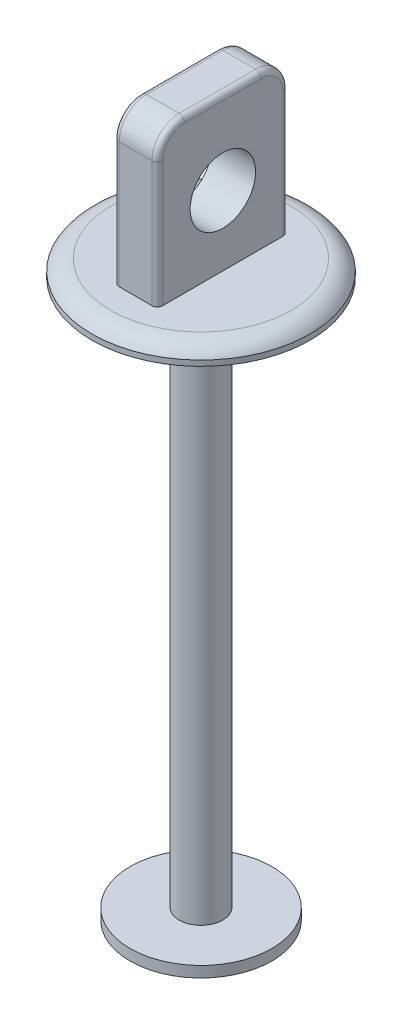
ISO-10303-21;
HEADER;
FILE_DESCRIPTION(('STEP AP214'),'2;1');
FILE_NAME('part.step','',(''),(''),'','','');
FILE_SCHEMA(('AUTOMOTIVE_DESIGN { 1 0 10303 214 1 1 1 1 }'));
ENDSEC;
DATA;
#1=APPLICATION_CONTEXT('core data for automotive mechanical design processes');
#2=APPLICATION_PROTOCOL_DEFINITION('international standard','automotive_design',2000,#1);
#3=PRODUCT_CONTEXT('',#1,'mechanical');
#4=PRODUCT('Part','Part','',(#3));
#5=PRODUCT_RELATED_PRODUCT_CATEGORY('part','',(#4));
#6=PRODUCT_DEFINITION_FORMATION('','',#4);
#7=PRODUCT_DEFINITION_CONTEXT('part definition',#1,'design');
#8=PRODUCT_DEFINITION('design','',#6,#7);
#9=PRODUCT_DEFINITION_SHAPE('','',#8);
#10=(LENGTH_UNIT() NAMED_UNIT(*) SI_UNIT(.MILLI.,.METRE.));
#11=(NAMED_UNIT(*) PLANE_ANGLE_UNIT() SI_UNIT($,.RADIAN.));
#12=(NAMED_UNIT(*) SI_UNIT($,.STERADIAN.) SOLID_ANGLE_UNIT());
#13=UNCERTAINTY_MEASURE_WITH_UNIT(LENGTH_MEASURE(1.E-05),#10,'distance_accuracy_value','');
#14=(GEOMETRIC_REPRESENTATION_CONTEXT(3) GLOBAL_UNCERTAINTY_ASSIGNED_CONTEXT((#13)) GLOBAL_UNIT_ASSIGNED_CONTEXT((#10,
#11,#12)) REPRESENTATION_CONTEXT('',''));
#15=CARTESIAN_POINT('',(0.,0.,0.));
#16=DIRECTION('',(0.,0.,1.));
#17=DIRECTION('',(1.,0.,0.));
#18=AXIS2_PLACEMENT_3D('',#15,#16,#17);
#19=CARTESIAN_POINT('',(0.,105.,0.));
#20=DIRECTION('',(0.,1.,0.));
#21=DIRECTION('',(0.,0.,1.));
#22=AXIS2_PLACEMENT_3D('',#19,#20,#21);
#23=PLANE('',#22);
#24=CARTESIAN_POINT('',(0.,105.,0.));
#25=DIRECTION('',(0.,1.,0.));
#26=DIRECTION('',(0.,0.,1.));
#27=AXIS2_PLACEMENT_3D('',#24,#25,#26);
#28=CIRCLE('',#27,16.5358983848622);
#29=CARTESIAN_POINT('',(0.,105.,16.5358983848622));
#30=VERTEX_POINT('',#29);
#31=EDGE_CURVE('E11',#30,#30,#28,.T.);
#32=ORIENTED_EDGE('',*,*,#31,.T.);
#33=EDGE_LOOP('',(#32));
#34=FACE_BOUND('',#33,.T.);
#35=ADVANCED_FACE('F49',(#34),#23,.T.);
#36=CARTESIAN_POINT('',(0.,103.,0.));
#37=DIRECTION('',(0.,1.,0.));
#38=DIRECTION('',(0.,0.,1.));
#39=AXIS2_PLACEMENT_3D('',#36,#37,#38);
#40=PLANE('',#39);
#41=CARTESIAN_POINT('',(0.,103.,0.));
#42=DIRECTION('',(0.,1.,0.));
#43=DIRECTION('',(0.,0.,1.));
#44=AXIS2_PLACEMENT_3D('',#41,#42,#43);
#45=CIRCLE('',#44,20.);
#46=CARTESIAN_POINT('',(0.,103.,20.));
#47=VERTEX_POINT('',#46);
#48=EDGE_CURVE('E56',#47,#47,#45,.T.);
#49=ORIENTED_EDGE('',*,*,#48,.F.);
#50=EDGE_LOOP('',(#49));
#51=FACE_BOUND('',#50,.T.);
#52=ADVANCED_FACE('F64',(#51),#40,.F.);
#53=CARTESIAN_POINT('',(0.,101.,0.));
#54=DIRECTION('',(0.,-1.,0.));
#55=DIRECTION('',(0.,0.,-1.));
#56=AXIS2_PLACEMENT_3D('',#53,#54,#55);
#57=TOROIDAL_SURFACE('',#56,16.5358983848622,4.);
#58=ORIENTED_EDGE('',*,*,#48,.T.);
#59=EDGE_LOOP('',(#58));
#60=FACE_BOUND('',#59,.T.);
#61=ORIENTED_EDGE('',*,*,#31,.F.);
#62=EDGE_LOOP('',(#61));
#63=FACE_BOUND('',#62,.T.);
#64=ADVANCED_FACE('F51',(#60,#63),#57,.T.);
#65=CLOSED_SHELL('',(#35,#52,#64));
#66=MANIFOLD_SOLID_BREP('B2',#65);
#67=CARTESIAN_POINT('',(0.,2.,0.));
#68=DIRECTION('',(0.,-1.,0.));
#69=DIRECTION('',(0.,0.,-1.));
#70=AXIS2_PLACEMENT_3D('',#67,#68,#69);
#71=CYLINDRICAL_SURFACE('',#70,13.);
#72=CARTESIAN_POINT('',(0.,2.,0.));
#73=DIRECTION('',(0.,1.,0.));
#74=DIRECTION('',(0.,0.,1.));
#75=AXIS2_PLACEMENT_3D('',#72,#73,#74);
#76=CIRCLE('',#75,13.);
#77=CARTESIAN_POINT('',(0.,2.,13.));
#78=VERTEX_POINT('',#77);
#79=EDGE_CURVE('E235',#78,#78,#76,.T.);
#80=ORIENTED_EDGE('',*,*,#79,.F.);
#81=EDGE_LOOP('',(#80));
#82=FACE_BOUND('',#81,.T.);
#83=CARTESIAN_POINT('',(0.,0.,0.));
#84=DIRECTION('',(0.,1.,0.));
#85=DIRECTION('',(0.,0.,1.));
#86=AXIS2_PLACEMENT_3D('',#83,#84,#85);
#87=CIRCLE('',#86,13.);
#88=CARTESIAN_POINT('',(0.,0.,13.));
#89=VERTEX_POINT('',#88);
#90=EDGE_CURVE('E227',#89,#89,#87,.T.);
#91=ORIENTED_EDGE('',*,*,#90,.T.);
#92=EDGE_LOOP('',(#91));
#93=FACE_BOUND('',#92,.T.);
#94=ADVANCED_FACE('F90',(#82,#93),#71,.T.);
#95=CARTESIAN_POINT('',(0.,2.,0.));
#96=DIRECTION('',(0.,1.,0.));
#97=DIRECTION('',(0.,0.,1.));
#98=AXIS2_PLACEMENT_3D('',#95,#96,#97);
#99=PLANE('',#98);
#100=CARTESIAN_POINT('',(0.,2.,0.));
#101=DIRECTION('',(0.,1.,0.));
#102=DIRECTION('',(0.,0.,1.));
#103=AXIS2_PLACEMENT_3D('',#100,#101,#102);
#104=CIRCLE('',#103,4.);
#105=CARTESIAN_POINT('',(0.,2.,4.));
#106=VERTEX_POINT('',#105);
#107=EDGE_CURVE('E231',#106,#106,#104,.T.);
#108=ORIENTED_EDGE('',*,*,#107,.F.);
#109=EDGE_LOOP('',(#108));
#110=FACE_BOUND('',#109,.T.);
#111=ORIENTED_EDGE('',*,*,#79,.T.);
#112=EDGE_LOOP('',(#111));
#113=FACE_BOUND('',#112,.T.);
#114=ADVANCED_FACE('F372',(#110,#113),#99,.T.);
#115=CARTESIAN_POINT('',(0.,0.,0.));
#116=DIRECTION('',(0.,1.,0.));
#117=DIRECTION('',(0.,0.,1.));
#118=AXIS2_PLACEMENT_3D('',#115,#116,#117);
#119=PLANE('',#118);
#120=ORIENTED_EDGE('',*,*,#90,.F.);
#121=EDGE_LOOP('',(#120));
#122=FACE_BOUND('',#121,.T.);
#123=ADVANCED_FACE('F379',(#122),#119,.F.);
#124=CARTESIAN_POINT('',(0.,102.,0.));
#125=DIRECTION('',(0.,-1.,0.));
#126=DIRECTION('',(0.,0.,-1.));
#127=AXIS2_PLACEMENT_3D('',#124,#125,#126);
#128=CYLINDRICAL_SURFACE('',#127,4.);
#129=CARTESIAN_POINT('',(0.,101.,0.));
#130=DIRECTION('',(0.,-1.,0.));
#131=DIRECTION('',(0.,0.,-1.));
#132=AXIS2_PLACEMENT_3D('',#129,#130,#131);
#133=CIRCLE('',#132,4.);
#134=CARTESIAN_POINT('',(0.,101.,-4.));
#135=VERTEX_POINT('',#134);
#136=EDGE_CURVE('E223',#135,#135,#133,.T.);
#137=ORIENTED_EDGE('',*,*,#136,.T.);
#138=EDGE_LOOP('',(#137));
#139=FACE_BOUND('',#138,.T.);
#140=ORIENTED_EDGE('',*,*,#107,.T.);
#141=EDGE_LOOP('',(#140));
#142=FACE_BOUND('',#141,.T.);
#143=ADVANCED_FACE('F537',(#139,#142),#128,.T.);
#144=CARTESIAN_POINT('',(0.,101.,0.));
#145=DIRECTION('',(0.,1.,0.));
#146=DIRECTION('',(0.,0.,1.));
#147=AXIS2_PLACEMENT_3D('',#144,#145,#146);
#148=CYLINDRICAL_SURFACE('',#147,17.);
#149=CARTESIAN_POINT('',(0.,101.,0.));
#150=DIRECTION('',(0.,-1.,0.));
#151=DIRECTION('',(0.,0.,-1.));
#152=AXIS2_PLACEMENT_3D('',#149,#150,#151);
#153=CIRCLE('',#152,17.);
#154=CARTESIAN_POINT('',(0.,101.,-17.));
#155=VERTEX_POINT('',#154);
#156=EDGE_CURVE('E220',#155,#155,#153,.T.);
#157=ORIENTED_EDGE('',*,*,#156,.F.);
#158=EDGE_LOOP('',(#157));
#159=FACE_BOUND('',#158,.T.);
#160=CARTESIAN_POINT('',(0.,102.,0.));
#161=DIRECTION('',(0.,1.,0.));
#162=DIRECTION('',(0.,0.,1.));
#163=AXIS2_PLACEMENT_3D('',#160,#161,#162);
#164=CIRCLE('',#163,17.);
#165=CARTESIAN_POINT('',(0.,102.,17.));
#166=VERTEX_POINT('',#165);
#167=EDGE_CURVE('E234',#166,#166,#164,.F.);
#168=ORIENTED_EDGE('',*,*,#167,.T.);
#169=EDGE_LOOP('',(#168));
#170=FACE_BOUND('',#169,.T.);
#171=ADVANCED_FACE('F528',(#159,#170),#148,.T.);
#172=CARTESIAN_POINT('',(0.,101.,0.));
#173=DIRECTION('',(0.,-1.,0.));
#174=DIRECTION('',(0.,0.,-1.));
#175=AXIS2_PLACEMENT_3D('',#172,#173,#174);
#176=PLANE('',#175);
#177=ORIENTED_EDGE('',*,*,#136,.F.);
#178=EDGE_LOOP('',(#177));
#179=FACE_BOUND('',#178,.T.);
#180=ORIENTED_EDGE('',*,*,#156,.T.);
#181=EDGE_LOOP('',(#180));
#182=FACE_BOUND('',#181,.T.);
#183=ADVANCED_FACE('F524',(#179,#182),#176,.T.);
#184=CARTESIAN_POINT('',(0.,103.,0.));
#185=DIRECTION('',(0.,1.,0.));
#186=DIRECTION('',(0.,0.,1.));
#187=AXIS2_PLACEMENT_3D('',#184,#185,#186);
#188=PLANE('',#187);
#189=DIRECTION('',(0.,0.,1.));
#190=VECTOR('',#189,1.);
#191=CARTESIAN_POINT('',(-4.,103.,12.));
#192=LINE('',#191,#190);
#193=CARTESIAN_POINT('',(-4.,103.,-11.));
#194=VERTEX_POINT('',#193);
#195=CARTESIAN_POINT('',(-4.,103.,11.));
#196=VERTEX_POINT('',#195);
#197=EDGE_CURVE('E195',#194,#196,#192,.T.);
#198=ORIENTED_EDGE('',*,*,#197,.F.);
#199=CARTESIAN_POINT('',(-3.,103.,-11.));
#200=DIRECTION('',(0.,1.,0.));
#201=DIRECTION('',(0.,0.,1.));
#202=AXIS2_PLACEMENT_3D('',#199,#200,#201);
#203=CIRCLE('',#202,1.);
#204=CARTESIAN_POINT('',(-3.,103.,-12.));
#205=VERTEX_POINT('',#204);
#206=EDGE_CURVE('E181',#194,#205,#203,.F.);
#207=ORIENTED_EDGE('',*,*,#206,.T.);
#208=DIRECTION('',(-1.,0.,0.));
#209=VECTOR('',#208,1.);
#210=CARTESIAN_POINT('',(4.,103.,-12.));
#211=LINE('',#210,#209);
#212=CARTESIAN_POINT('',(3.,103.,-12.));
#213=VERTEX_POINT('',#212);
#214=EDGE_CURVE('E218',#213,#205,#211,.T.);
#215=ORIENTED_EDGE('',*,*,#214,.F.);
#216=CARTESIAN_POINT('',(3.,103.,-11.));
#217=DIRECTION('',(0.,1.,0.));
#218=DIRECTION('',(0.,0.,1.));
#219=AXIS2_PLACEMENT_3D('',#216,#217,#218);
#220=CIRCLE('',#219,1.);
#221=CARTESIAN_POINT('',(4.,103.,-11.));
#222=VERTEX_POINT('',#221);
#223=EDGE_CURVE('E190',#213,#222,#220,.F.);
#224=ORIENTED_EDGE('',*,*,#223,.T.);
#225=DIRECTION('',(0.,0.,-1.));
#226=VECTOR('',#225,1.);
#227=CARTESIAN_POINT('',(4.,103.,12.));
#228=LINE('',#227,#226);
#229=CARTESIAN_POINT('',(4.,103.,11.));
#230=VERTEX_POINT('',#229);
#231=EDGE_CURVE('E208',#230,#222,#228,.T.);
#232=ORIENTED_EDGE('',*,*,#231,.F.);
#233=CARTESIAN_POINT('',(3.,103.,11.));
#234=DIRECTION('',(0.,1.,0.));
#235=DIRECTION('',(0.,0.,1.));
#236=AXIS2_PLACEMENT_3D('',#233,#234,#235);
#237=CIRCLE('',#236,1.);
#238=CARTESIAN_POINT('',(3.,103.,12.));
#239=VERTEX_POINT('',#238);
#240=EDGE_CURVE('E47',#230,#239,#237,.F.);
#241=ORIENTED_EDGE('',*,*,#240,.T.);
#242=DIRECTION('',(1.,0.,0.));
#243=VECTOR('',#242,1.);
#244=CARTESIAN_POINT('',(4.,103.,12.));
#245=LINE('',#244,#243);
#246=CARTESIAN_POINT('',(-3.,103.,12.));
#247=VERTEX_POINT('',#246);
#248=EDGE_CURVE('E205',#247,#239,#245,.T.);
#249=ORIENTED_EDGE('',*,*,#248,.F.);
#250=CARTESIAN_POINT('',(-3.,103.,11.));
#251=DIRECTION('',(0.,1.,0.));
#252=DIRECTION('',(0.,0.,1.));
#253=AXIS2_PLACEMENT_3D('',#250,#251,#252);
#254=CIRCLE('',#253,1.);
#255=EDGE_CURVE('E99',#247,#196,#254,.F.);
#256=ORIENTED_EDGE('',*,*,#255,.T.);
#257=EDGE_LOOP('',(#198,#207,#215,#224,#232,#241,#249,#256));
#258=FACE_BOUND('',#257,.T.);
#259=CARTESIAN_POINT('',(0.,103.,0.));
#260=DIRECTION('',(0.,1.,0.));
#261=DIRECTION('',(0.,0.,1.));
#262=AXIS2_PLACEMENT_3D('',#259,#260,#261);
#263=CIRCLE('',#262,20.);
#264=CARTESIAN_POINT('',(0.,103.,20.));
#265=VERTEX_POINT('',#264);
#266=EDGE_CURVE('E224',#265,#265,#263,.T.);
#267=ORIENTED_EDGE('',*,*,#266,.T.);
#268=EDGE_LOOP('',(#267));
#269=FACE_BOUND('',#268,.T.);
#270=ADVANCED_FACE('F202',(#258,#269),#188,.T.);
#271=CARTESIAN_POINT('',(0.,103.,0.));
#272=DIRECTION('',(0.,-1.,0.));
#273=DIRECTION('',(0.,0.,-1.));
#274=AXIS2_PLACEMENT_3D('',#271,#272,#273);
#275=CYLINDRICAL_SURFACE('',#274,20.);
#276=ORIENTED_EDGE('',*,*,#266,.F.);
#277=EDGE_LOOP('',(#276));
#278=FACE_BOUND('',#277,.T.);
#279=CARTESIAN_POINT('',(0.,102.,0.));
#280=DIRECTION('',(0.,1.,0.));
#281=DIRECTION('',(0.,0.,1.));
#282=AXIS2_PLACEMENT_3D('',#279,#280,#281);
#283=CIRCLE('',#282,20.);
#284=CARTESIAN_POINT('',(0.,102.,20.));
#285=VERTEX_POINT('',#284);
#286=EDGE_CURVE('E228',#285,#285,#283,.T.);
#287=ORIENTED_EDGE('',*,*,#286,.T.);
#288=EDGE_LOOP('',(#287));
#289=FACE_BOUND('',#288,.T.);
#290=ADVANCED_FACE('F546',(#278,#289),#275,.T.);
#291=CARTESIAN_POINT('',(0.,102.,0.));
#292=DIRECTION('',(0.,1.,0.));
#293=DIRECTION('',(0.,0.,1.));
#294=AXIS2_PLACEMENT_3D('',#291,#292,#293);
#295=PLANE('',#294);
#296=ORIENTED_EDGE('',*,*,#167,.F.);
#297=EDGE_LOOP('',(#296));
#298=FACE_BOUND('',#297,.T.);
#299=ORIENTED_EDGE('',*,*,#286,.F.);
#300=EDGE_LOOP('',(#299));
#301=FACE_BOUND('',#300,.T.);
#302=ADVANCED_FACE('F449',(#298,#301),#295,.F.);
#303=CARTESIAN_POINT('',(-4.,133.,12.));
#304=DIRECTION('',(1.,0.,0.));
#305=DIRECTION('',(0.,0.,-1.));
#306=AXIS2_PLACEMENT_3D('',#303,#304,#305);
#307=PLANE('',#306);
#308=CARTESIAN_POINT('',(-4.,117.767190526072,0.));
#309=DIRECTION('',(1.,0.,0.));
#310=DIRECTION('',(0.,0.,-1.));
#311=AXIS2_PLACEMENT_3D('',#308,#309,#310);
#312=CIRCLE('',#311,6.);
#313=CARTESIAN_POINT('',(-4.,117.767190526072,-6.));
#314=VERTEX_POINT('',#313);
#315=EDGE_CURVE('E214',#314,#314,#312,.T.);
#316=ORIENTED_EDGE('',*,*,#315,.T.);
#317=EDGE_LOOP('',(#316));
#318=FACE_BOUND('',#317,.T.);
#319=CARTESIAN_POINT('',(-4.,128.,-7.));
#320=DIRECTION('',(1.,0.,0.));
#321=DIRECTION('',(0.,0.,-1.));
#322=AXIS2_PLACEMENT_3D('',#319,#320,#321);
#323=CIRCLE('',#322,4.);
#324=CARTESIAN_POINT('',(-4.,132.,-7.));
#325=VERTEX_POINT('',#324);
#326=CARTESIAN_POINT('',(-4.,128.,-11.));
#327=VERTEX_POINT('',#326);
#328=EDGE_CURVE('E198',#325,#327,#323,.F.);
#329=ORIENTED_EDGE('',*,*,#328,.T.);
#330=DIRECTION('',(0.,-1.,0.));
#331=VECTOR('',#330,1.);
#332=CARTESIAN_POINT('',(-4.,133.,-11.));
#333=LINE('',#332,#331);
#334=EDGE_CURVE('E185',#327,#194,#333,.T.);
#335=ORIENTED_EDGE('',*,*,#334,.T.);
#336=ORIENTED_EDGE('',*,*,#197,.T.);
#337=DIRECTION('',(0.,-1.,0.));
#338=VECTOR('',#337,1.);
#339=CARTESIAN_POINT('',(-4.,133.,11.));
#340=LINE('',#339,#338);
#341=CARTESIAN_POINT('',(-4.,128.,11.));
#342=VERTEX_POINT('',#341);
#343=EDGE_CURVE('E255',#196,#342,#340,.F.);
#344=ORIENTED_EDGE('',*,*,#343,.T.);
#345=CARTESIAN_POINT('',(-4.,128.,7.));
#346=DIRECTION('',(1.,0.,0.));
#347=DIRECTION('',(0.,0.,-1.));
#348=AXIS2_PLACEMENT_3D('',#345,#346,#347);
#349=CIRCLE('',#348,4.);
#350=CARTESIAN_POINT('',(-4.,132.,7.));
#351=VERTEX_POINT('',#350);
#352=EDGE_CURVE('E257',#342,#351,#349,.F.);
#353=ORIENTED_EDGE('',*,*,#352,.T.);
#354=DIRECTION('',(0.,0.,1.));
#355=VECTOR('',#354,1.);
#356=CARTESIAN_POINT('',(-4.,132.,-7.));
#357=LINE('',#356,#355);
#358=EDGE_CURVE('E259',#351,#325,#357,.F.);
#359=ORIENTED_EDGE('',*,*,#358,.T.);
#360=EDGE_LOOP('',(#329,#335,#336,#344,#353,#359));
#361=FACE_BOUND('',#360,.T.);
#362=ADVANCED_FACE('F194',(#318,#361),#307,.F.);
#363=CARTESIAN_POINT('',(4.,133.,12.));
#364=DIRECTION('',(0.,0.,-1.));
#365=DIRECTION('',(-1.,0.,0.));
#366=AXIS2_PLACEMENT_3D('',#363,#364,#365);
#367=PLANE('',#366);
#368=DIRECTION('',(1.,0.,0.));
#369=VECTOR('',#368,1.);
#370=CARTESIAN_POINT('',(-4.,128.,12.));
#371=LINE('',#370,#369);
#372=CARTESIAN_POINT('',(3.,128.,12.));
#373=VERTEX_POINT('',#372);
#374=CARTESIAN_POINT('',(-3.,128.,12.));
#375=VERTEX_POINT('',#374);
#376=EDGE_CURVE('E253',#373,#375,#371,.F.);
#377=ORIENTED_EDGE('',*,*,#376,.T.);
#378=DIRECTION('',(0.,-1.,0.));
#379=VECTOR('',#378,1.);
#380=CARTESIAN_POINT('',(-3.,133.,12.));
#381=LINE('',#380,#379);
#382=EDGE_CURVE('E112',#375,#247,#381,.T.);
#383=ORIENTED_EDGE('',*,*,#382,.T.);
#384=ORIENTED_EDGE('',*,*,#248,.T.);
#385=DIRECTION('',(0.,-1.,0.));
#386=VECTOR('',#385,1.);
#387=CARTESIAN_POINT('',(3.,133.,12.));
#388=LINE('',#387,#386);
#389=EDGE_CURVE('E287',#239,#373,#388,.F.);
#390=ORIENTED_EDGE('',*,*,#389,.T.);
#391=EDGE_LOOP('',(#377,#383,#384,#390));
#392=FACE_BOUND('',#391,.T.);
#393=ADVANCED_FACE('F448',(#392),#367,.F.);
#394=CARTESIAN_POINT('',(4.,133.,12.));
#395=DIRECTION('',(-1.,0.,0.));
#396=DIRECTION('',(0.,0.,1.));
#397=AXIS2_PLACEMENT_3D('',#394,#395,#396);
#398=PLANE('',#397);
#399=CARTESIAN_POINT('',(4.,117.767190526072,0.));
#400=DIRECTION('',(-1.,0.,0.));
#401=DIRECTION('',(0.,0.,1.));
#402=AXIS2_PLACEMENT_3D('',#399,#400,#401);
#403=CIRCLE('',#402,6.);
#404=CARTESIAN_POINT('',(4.,117.767190526072,6.));
#405=VERTEX_POINT('',#404);
#406=EDGE_CURVE('E94',#405,#405,#403,.T.);
#407=ORIENTED_EDGE('',*,*,#406,.T.);
#408=EDGE_LOOP('',(#407));
#409=FACE_BOUND('',#408,.T.);
#410=ORIENTED_EDGE('',*,*,#231,.T.);
#411=DIRECTION('',(0.,-1.,0.));
#412=VECTOR('',#411,1.);
#413=CARTESIAN_POINT('',(4.,133.,-11.));
#414=LINE('',#413,#412);
#415=CARTESIAN_POINT('',(4.,128.,-11.));
#416=VERTEX_POINT('',#415);
#417=EDGE_CURVE('E285',#222,#416,#414,.F.);
#418=ORIENTED_EDGE('',*,*,#417,.T.);
#419=CARTESIAN_POINT('',(4.,128.,-7.));
#420=DIRECTION('',(-1.,0.,0.));
#421=DIRECTION('',(0.,0.,1.));
#422=AXIS2_PLACEMENT_3D('',#419,#420,#421);
#423=CIRCLE('',#422,4.);
#424=CARTESIAN_POINT('',(4.,132.,-7.));
#425=VERTEX_POINT('',#424);
#426=EDGE_CURVE('E283',#416,#425,#423,.F.);
#427=ORIENTED_EDGE('',*,*,#426,.T.);
#428=DIRECTION('',(0.,0.,-1.));
#429=VECTOR('',#428,1.);
#430=CARTESIAN_POINT('',(4.,132.,7.));
#431=LINE('',#430,#429);
#432=CARTESIAN_POINT('',(4.,132.,7.));
#433=VERTEX_POINT('',#432);
#434=EDGE_CURVE('E281',#425,#433,#431,.F.);
#435=ORIENTED_EDGE('',*,*,#434,.T.);
#436=CARTESIAN_POINT('',(4.,128.,7.));
#437=DIRECTION('',(-1.,0.,0.));
#438=DIRECTION('',(0.,0.,1.));
#439=AXIS2_PLACEMENT_3D('',#436,#437,#438);
#440=CIRCLE('',#439,4.);
#441=CARTESIAN_POINT('',(4.,128.,11.));
#442=VERTEX_POINT('',#441);
#443=EDGE_CURVE('E279',#433,#442,#440,.F.);
#444=ORIENTED_EDGE('',*,*,#443,.T.);
#445=DIRECTION('',(0.,-1.,0.));
#446=VECTOR('',#445,1.);
#447=CARTESIAN_POINT('',(4.,133.,11.));
#448=LINE('',#447,#446);
#449=EDGE_CURVE('E277',#442,#230,#448,.T.);
#450=ORIENTED_EDGE('',*,*,#449,.T.);
#451=EDGE_LOOP('',(#410,#418,#427,#435,#444,#450));
#452=FACE_BOUND('',#451,.T.);
#453=ADVANCED_FACE('F319',(#409,#452),#398,.F.);
#454=CARTESIAN_POINT('',(4.,133.,-12.));
#455=DIRECTION('',(0.,0.,1.));
#456=DIRECTION('',(1.,0.,0.));
#457=AXIS2_PLACEMENT_3D('',#454,#455,#456);
#458=PLANE('',#457);
#459=ORIENTED_EDGE('',*,*,#214,.T.);
#460=DIRECTION('',(0.,-1.,0.));
#461=VECTOR('',#460,1.);
#462=CARTESIAN_POINT('',(-3.,133.,-12.));
#463=LINE('',#462,#461);
#464=CARTESIAN_POINT('',(-3.,128.,-12.));
#465=VERTEX_POINT('',#464);
#466=EDGE_CURVE('E186',#205,#465,#463,.F.);
#467=ORIENTED_EDGE('',*,*,#466,.T.);
#468=DIRECTION('',(-1.,0.,0.));
#469=VECTOR('',#468,1.);
#470=CARTESIAN_POINT('',(4.,128.,-12.));
#471=LINE('',#470,#469);
#472=CARTESIAN_POINT('',(3.,128.,-12.));
#473=VERTEX_POINT('',#472);
#474=EDGE_CURVE('E250',#465,#473,#471,.F.);
#475=ORIENTED_EDGE('',*,*,#474,.T.);
#476=DIRECTION('',(0.,-1.,0.));
#477=VECTOR('',#476,1.);
#478=CARTESIAN_POINT('',(3.,133.,-12.));
#479=LINE('',#478,#477);
#480=EDGE_CURVE('E200',#473,#213,#479,.T.);
#481=ORIENTED_EDGE('',*,*,#480,.T.);
#482=EDGE_LOOP('',(#459,#467,#475,#481));
#483=FACE_BOUND('',#482,.T.);
#484=ADVANCED_FACE('F325',(#483),#458,.F.);
#485=CARTESIAN_POINT('',(0.,133.,0.));
#486=DIRECTION('',(0.,1.,0.));
#487=DIRECTION('',(0.,0.,1.));
#488=AXIS2_PLACEMENT_3D('',#485,#486,#487);
#489=PLANE('',#488);
#490=DIRECTION('',(-1.,0.,0.));
#491=VECTOR('',#490,1.);
#492=CARTESIAN_POINT('',(-4.,133.,-7.));
#493=LINE('',#492,#491);
#494=CARTESIAN_POINT('',(3.,133.,-7.));
#495=VERTEX_POINT('',#494);
#496=CARTESIAN_POINT('',(-3.,133.,-7.));
#497=VERTEX_POINT('',#496);
#498=EDGE_CURVE('E247',#495,#497,#493,.T.);
#499=ORIENTED_EDGE('',*,*,#498,.T.);
#500=DIRECTION('',(0.,0.,1.));
#501=VECTOR('',#500,1.);
#502=CARTESIAN_POINT('',(-3.,133.,7.));
#503=LINE('',#502,#501);
#504=CARTESIAN_POINT('',(-3.,133.,7.));
#505=VERTEX_POINT('',#504);
#506=EDGE_CURVE('E271',#497,#505,#503,.T.);
#507=ORIENTED_EDGE('',*,*,#506,.T.);
#508=DIRECTION('',(1.,0.,0.));
#509=VECTOR('',#508,1.);
#510=CARTESIAN_POINT('',(4.,133.,7.));
#511=LINE('',#510,#509);
#512=CARTESIAN_POINT('',(3.,133.,7.));
#513=VERTEX_POINT('',#512);
#514=EDGE_CURVE('E242',#505,#513,#511,.T.);
#515=ORIENTED_EDGE('',*,*,#514,.T.);
#516=DIRECTION('',(0.,0.,-1.));
#517=VECTOR('',#516,1.);
#518=CARTESIAN_POINT('',(3.,133.,-7.));
#519=LINE('',#518,#517);
#520=EDGE_CURVE('E269',#513,#495,#519,.T.);
#521=ORIENTED_EDGE('',*,*,#520,.T.);
#522=EDGE_LOOP('',(#499,#507,#515,#521));
#523=FACE_BOUND('',#522,.T.);
#524=ADVANCED_FACE('F341',(#523),#489,.T.);
#525=CARTESIAN_POINT('',(0.,128.,-7.));
#526=DIRECTION('',(1.,0.,0.));
#527=DIRECTION('',(0.,0.,-1.));
#528=AXIS2_PLACEMENT_3D('',#525,#526,#527);
#529=CYLINDRICAL_SURFACE('',#528,5.);
#530=ORIENTED_EDGE('',*,*,#474,.F.);
#531=CARTESIAN_POINT('',(-3.,128.,-7.));
#532=DIRECTION('',(1.,0.,0.));
#533=DIRECTION('',(0.,0.,-1.));
#534=AXIS2_PLACEMENT_3D('',#531,#532,#533);
#535=CIRCLE('',#534,5.);
#536=EDGE_CURVE('E267',#465,#497,#535,.T.);
#537=ORIENTED_EDGE('',*,*,#536,.T.);
#538=ORIENTED_EDGE('',*,*,#498,.F.);
#539=CARTESIAN_POINT('',(3.,128.,-7.));
#540=DIRECTION('',(-1.,0.,0.));
#541=DIRECTION('',(0.,0.,1.));
#542=AXIS2_PLACEMENT_3D('',#539,#540,#541);
#543=CIRCLE('',#542,5.);
#544=EDGE_CURVE('E265',#495,#473,#543,.T.);
#545=ORIENTED_EDGE('',*,*,#544,.T.);
#546=EDGE_LOOP('',(#530,#537,#538,#545));
#547=FACE_BOUND('',#546,.T.);
#548=ADVANCED_FACE('F344',(#547),#529,.T.);
#549=CARTESIAN_POINT('',(0.,128.,7.));
#550=DIRECTION('',(-1.,0.,0.));
#551=DIRECTION('',(0.,0.,1.));
#552=AXIS2_PLACEMENT_3D('',#549,#550,#551);
#553=CYLINDRICAL_SURFACE('',#552,5.);
#554=ORIENTED_EDGE('',*,*,#514,.F.);
#555=CARTESIAN_POINT('',(-3.,128.,7.));
#556=DIRECTION('',(1.,0.,0.));
#557=DIRECTION('',(0.,0.,-1.));
#558=AXIS2_PLACEMENT_3D('',#555,#556,#557);
#559=CIRCLE('',#558,5.);
#560=EDGE_CURVE('E275',#505,#375,#559,.T.);
#561=ORIENTED_EDGE('',*,*,#560,.T.);
#562=ORIENTED_EDGE('',*,*,#376,.F.);
#563=CARTESIAN_POINT('',(3.,128.,7.));
#564=DIRECTION('',(-1.,0.,0.));
#565=DIRECTION('',(0.,0.,1.));
#566=AXIS2_PLACEMENT_3D('',#563,#564,#565);
#567=CIRCLE('',#566,5.);
#568=EDGE_CURVE('E273',#373,#513,#567,.T.);
#569=ORIENTED_EDGE('',*,*,#568,.T.);
#570=EDGE_LOOP('',(#554,#561,#562,#569));
#571=FACE_BOUND('',#570,.T.);
#572=ADVANCED_FACE('F354',(#571),#553,.T.);
#573=CARTESIAN_POINT('',(-3.,133.,11.));
#574=DIRECTION('',(0.,-1.,0.));
#575=DIRECTION('',(0.,0.,-1.));
#576=AXIS2_PLACEMENT_3D('',#573,#574,#575);
#577=CYLINDRICAL_SURFACE('',#576,1.);
#578=ORIENTED_EDGE('',*,*,#255,.F.);
#579=ORIENTED_EDGE('',*,*,#382,.F.);
#580=CARTESIAN_POINT('',(-3.,128.,11.));
#581=DIRECTION('',(0.,1.,0.));
#582=DIRECTION('',(0.,0.,1.));
#583=AXIS2_PLACEMENT_3D('',#580,#581,#582);
#584=CIRCLE('',#583,1.);
#585=EDGE_CURVE('E206',#342,#375,#584,.T.);
#586=ORIENTED_EDGE('',*,*,#585,.F.);
#587=ORIENTED_EDGE('',*,*,#343,.F.);
#588=EDGE_LOOP('',(#578,#579,#586,#587));
#589=FACE_BOUND('',#588,.T.);
#590=ADVANCED_FACE('F361',(#589),#577,.T.);
#591=CARTESIAN_POINT('',(-3.,128.,7.));
#592=DIRECTION('',(1.,0.,0.));
#593=DIRECTION('',(0.,0.,-1.));
#594=AXIS2_PLACEMENT_3D('',#591,#592,#593);
#595=TOROIDAL_SURFACE('',#594,4.,1.);
#596=ORIENTED_EDGE('',*,*,#585,.T.);
#597=ORIENTED_EDGE('',*,*,#560,.F.);
#598=CARTESIAN_POINT('',(-3.,132.,7.));
#599=DIRECTION('',(0.,0.,-1.));
#600=DIRECTION('',(-1.,0.,0.));
#601=AXIS2_PLACEMENT_3D('',#598,#599,#600);
#602=CIRCLE('',#601,1.);
#603=EDGE_CURVE('E211',#351,#505,#602,.T.);
#604=ORIENTED_EDGE('',*,*,#603,.F.);
#605=ORIENTED_EDGE('',*,*,#352,.F.);
#606=EDGE_LOOP('',(#596,#597,#604,#605));
#607=FACE_BOUND('',#606,.T.);
#608=ADVANCED_FACE('F357',(#607),#595,.T.);
#609=CARTESIAN_POINT('',(-3.,132.,0.));
#610=DIRECTION('',(0.,0.,-1.));
#611=DIRECTION('',(-1.,0.,0.));
#612=AXIS2_PLACEMENT_3D('',#609,#610,#611);
#613=CYLINDRICAL_SURFACE('',#612,1.);
#614=ORIENTED_EDGE('',*,*,#603,.T.);
#615=ORIENTED_EDGE('',*,*,#506,.F.);
#616=CARTESIAN_POINT('',(-3.,132.,-7.));
#617=DIRECTION('',(0.,0.,-1.));
#618=DIRECTION('',(-1.,0.,0.));
#619=AXIS2_PLACEMENT_3D('',#616,#617,#618);
#620=CIRCLE('',#619,1.);
#621=EDGE_CURVE('E294',#325,#497,#620,.T.);
#622=ORIENTED_EDGE('',*,*,#621,.F.);
#623=ORIENTED_EDGE('',*,*,#358,.F.);
#624=EDGE_LOOP('',(#614,#615,#622,#623));
#625=FACE_BOUND('',#624,.T.);
#626=ADVANCED_FACE('F350',(#625),#613,.T.);
#627=CARTESIAN_POINT('',(-3.,128.,-7.));
#628=DIRECTION('',(1.,0.,0.));
#629=DIRECTION('',(0.,0.,-1.));
#630=AXIS2_PLACEMENT_3D('',#627,#628,#629);
#631=TOROIDAL_SURFACE('',#630,4.,1.);
#632=ORIENTED_EDGE('',*,*,#621,.T.);
#633=ORIENTED_EDGE('',*,*,#536,.F.);
#634=CARTESIAN_POINT('',(-3.,128.,-11.));
#635=DIRECTION('',(0.,-1.,0.));
#636=DIRECTION('',(0.,0.,-1.));
#637=AXIS2_PLACEMENT_3D('',#634,#635,#636);
#638=CIRCLE('',#637,1.);
#639=EDGE_CURVE('E292',#327,#465,#638,.T.);
#640=ORIENTED_EDGE('',*,*,#639,.F.);
#641=ORIENTED_EDGE('',*,*,#328,.F.);
#642=EDGE_LOOP('',(#632,#633,#640,#641));
#643=FACE_BOUND('',#642,.T.);
#644=ADVANCED_FACE('F346',(#643),#631,.T.);
#645=CARTESIAN_POINT('',(-3.,133.,-11.));
#646=DIRECTION('',(0.,-1.,0.));
#647=DIRECTION('',(0.,0.,-1.));
#648=AXIS2_PLACEMENT_3D('',#645,#646,#647);
#649=CYLINDRICAL_SURFACE('',#648,1.);
#650=ORIENTED_EDGE('',*,*,#639,.T.);
#651=ORIENTED_EDGE('',*,*,#466,.F.);
#652=ORIENTED_EDGE('',*,*,#206,.F.);
#653=ORIENTED_EDGE('',*,*,#334,.F.);
#654=EDGE_LOOP('',(#650,#651,#652,#653));
#655=FACE_BOUND('',#654,.T.);
#656=ADVANCED_FACE('F184',(#655),#649,.T.);
#657=CARTESIAN_POINT('',(3.,133.,11.));
#658=DIRECTION('',(0.,-1.,0.));
#659=DIRECTION('',(0.,0.,-1.));
#660=AXIS2_PLACEMENT_3D('',#657,#658,#659);
#661=CYLINDRICAL_SURFACE('',#660,1.);
#662=ORIENTED_EDGE('',*,*,#240,.F.);
#663=ORIENTED_EDGE('',*,*,#449,.F.);
#664=CARTESIAN_POINT('',(3.,128.,11.));
#665=DIRECTION('',(0.,1.,0.));
#666=DIRECTION('',(0.,0.,1.));
#667=AXIS2_PLACEMENT_3D('',#664,#665,#666);
#668=CIRCLE('',#667,1.);
#669=EDGE_CURVE('E295',#373,#442,#668,.T.);
#670=ORIENTED_EDGE('',*,*,#669,.F.);
#671=ORIENTED_EDGE('',*,*,#389,.F.);
#672=EDGE_LOOP('',(#662,#663,#670,#671));
#673=FACE_BOUND('',#672,.T.);
#674=ADVANCED_FACE('F92',(#673),#661,.T.);
#675=CARTESIAN_POINT('',(3.,128.,7.));
#676=DIRECTION('',(-1.,0.,0.));
#677=DIRECTION('',(0.,0.,1.));
#678=AXIS2_PLACEMENT_3D('',#675,#676,#677);
#679=TOROIDAL_SURFACE('',#678,4.,1.);
#680=ORIENTED_EDGE('',*,*,#669,.T.);
#681=ORIENTED_EDGE('',*,*,#443,.F.);
#682=CARTESIAN_POINT('',(3.,132.,7.));
#683=DIRECTION('',(0.,0.,-1.));
#684=DIRECTION('',(-1.,0.,0.));
#685=AXIS2_PLACEMENT_3D('',#682,#683,#684);
#686=CIRCLE('',#685,1.);
#687=EDGE_CURVE('E306',#513,#433,#686,.T.);
#688=ORIENTED_EDGE('',*,*,#687,.F.);
#689=ORIENTED_EDGE('',*,*,#568,.F.);
#690=EDGE_LOOP('',(#680,#681,#688,#689));
#691=FACE_BOUND('',#690,.T.);
#692=ADVANCED_FACE('F313',(#691),#679,.T.);
#693=CARTESIAN_POINT('',(3.,132.,0.));
#694=DIRECTION('',(0.,0.,1.));
#695=DIRECTION('',(1.,0.,0.));
#696=AXIS2_PLACEMENT_3D('',#693,#694,#695);
#697=CYLINDRICAL_SURFACE('',#696,1.);
#698=ORIENTED_EDGE('',*,*,#687,.T.);
#699=ORIENTED_EDGE('',*,*,#434,.F.);
#700=CARTESIAN_POINT('',(3.,132.,-7.));
#701=DIRECTION('',(0.,0.,-1.));
#702=DIRECTION('',(-1.,0.,0.));
#703=AXIS2_PLACEMENT_3D('',#700,#701,#702);
#704=CIRCLE('',#703,1.);
#705=EDGE_CURVE('E303',#495,#425,#704,.T.);
#706=ORIENTED_EDGE('',*,*,#705,.F.);
#707=ORIENTED_EDGE('',*,*,#520,.F.);
#708=EDGE_LOOP('',(#698,#699,#706,#707));
#709=FACE_BOUND('',#708,.T.);
#710=ADVANCED_FACE('F337',(#709),#697,.T.);
#711=CARTESIAN_POINT('',(3.,128.,-7.));
#712=DIRECTION('',(-1.,0.,0.));
#713=DIRECTION('',(0.,0.,1.));
#714=AXIS2_PLACEMENT_3D('',#711,#712,#713);
#715=TOROIDAL_SURFACE('',#714,4.,1.);
#716=ORIENTED_EDGE('',*,*,#705,.T.);
#717=ORIENTED_EDGE('',*,*,#426,.F.);
#718=CARTESIAN_POINT('',(3.,128.,-11.));
#719=DIRECTION('',(0.,-1.,0.));
#720=DIRECTION('',(0.,0.,-1.));
#721=AXIS2_PLACEMENT_3D('',#718,#719,#720);
#722=CIRCLE('',#721,1.);
#723=EDGE_CURVE('E300',#473,#416,#722,.T.);
#724=ORIENTED_EDGE('',*,*,#723,.F.);
#725=ORIENTED_EDGE('',*,*,#544,.F.);
#726=EDGE_LOOP('',(#716,#717,#724,#725));
#727=FACE_BOUND('',#726,.T.);
#728=ADVANCED_FACE('F333',(#727),#715,.T.);
#729=CARTESIAN_POINT('',(3.,133.,-11.));
#730=DIRECTION('',(0.,-1.,0.));
#731=DIRECTION('',(0.,0.,-1.));
#732=AXIS2_PLACEMENT_3D('',#729,#730,#731);
#733=CYLINDRICAL_SURFACE('',#732,1.);
#734=ORIENTED_EDGE('',*,*,#723,.T.);
#735=ORIENTED_EDGE('',*,*,#417,.F.);
#736=ORIENTED_EDGE('',*,*,#223,.F.);
#737=ORIENTED_EDGE('',*,*,#480,.F.);
#738=EDGE_LOOP('',(#734,#735,#736,#737));
#739=FACE_BOUND('',#738,.T.);
#740=ADVANCED_FACE('F323',(#739),#733,.T.);
#741=CARTESIAN_POINT('',(20.,117.767190526072,0.));
#742=DIRECTION('',(-1.,0.,0.));
#743=DIRECTION('',(0.,0.,1.));
#744=AXIS2_PLACEMENT_3D('',#741,#742,#743);
#745=CYLINDRICAL_SURFACE('',#744,6.);
#746=ORIENTED_EDGE('',*,*,#406,.F.);
#747=EDGE_LOOP('',(#746));
#748=FACE_BOUND('',#747,.T.);
#749=ORIENTED_EDGE('',*,*,#315,.F.);
#750=EDGE_LOOP('',(#749));
#751=FACE_BOUND('',#750,.T.);
#752=ADVANCED_FACE('F440',(#748,#751),#745,.F.);
#753=CLOSED_SHELL('',(#94,#114,#123,#143,#171,#183,#270,#290,#302,#362,#393,#453,#484,#524,#548,
#572,#590,#608,#626,#644,#656,#674,#692,#710,#728,#740,#752));
#754=MANIFOLD_SOLID_BREP('B6',#753);
#755=ADVANCED_BREP_SHAPE_REPRESENTATION('',(#18,#66,#754),#14);
#756=SHAPE_DEFINITION_REPRESENTATION(#9,#755);
ENDSEC;
END-ISO-10303-21;
